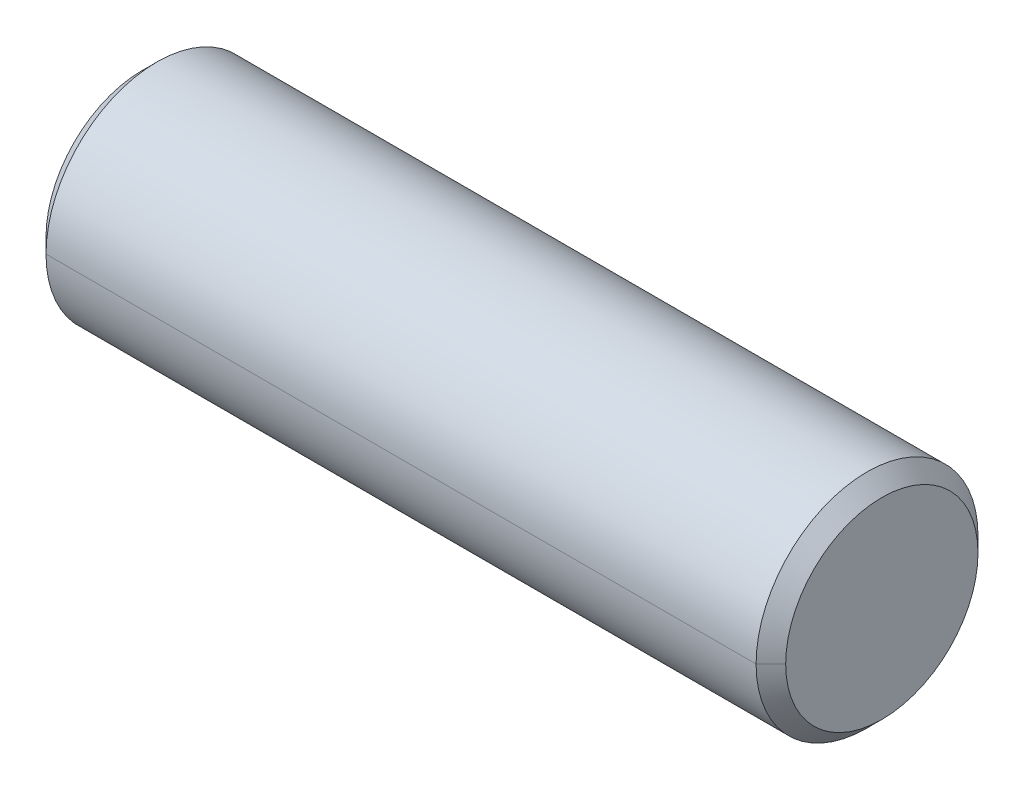
ISO-10303-21;
HEADER;
FILE_DESCRIPTION(('STEP AP214'),'2;1');
FILE_NAME('part.step','',(''),(''),'','','');
FILE_SCHEMA(('AUTOMOTIVE_DESIGN { 1 0 10303 214 1 1 1 1 }'));
ENDSEC;
DATA;
#1=APPLICATION_CONTEXT('core data for automotive mechanical design processes');
#2=APPLICATION_PROTOCOL_DEFINITION('international standard','automotive_design',2000,#1);
#3=PRODUCT_CONTEXT('',#1,'mechanical');
#4=PRODUCT('Part','Part','',(#3));
#5=PRODUCT_RELATED_PRODUCT_CATEGORY('part','',(#4));
#6=PRODUCT_DEFINITION_FORMATION('','',#4);
#7=PRODUCT_DEFINITION_CONTEXT('part definition',#1,'design');
#8=PRODUCT_DEFINITION('design','',#6,#7);
#9=PRODUCT_DEFINITION_SHAPE('','',#8);
#10=(LENGTH_UNIT() NAMED_UNIT(*) SI_UNIT(.MILLI.,.METRE.));
#11=(NAMED_UNIT(*) PLANE_ANGLE_UNIT() SI_UNIT($,.RADIAN.));
#12=(NAMED_UNIT(*) SI_UNIT($,.STERADIAN.) SOLID_ANGLE_UNIT());
#13=UNCERTAINTY_MEASURE_WITH_UNIT(LENGTH_MEASURE(1.E-05),#10,'distance_accuracy_value','');
#14=(GEOMETRIC_REPRESENTATION_CONTEXT(3) GLOBAL_UNCERTAINTY_ASSIGNED_CONTEXT((#13)) GLOBAL_UNIT_ASSIGNED_CONTEXT((#10,
#11,#12)) REPRESENTATION_CONTEXT('',''));
#15=CARTESIAN_POINT('',(0.,0.,0.));
#16=DIRECTION('',(0.,0.,1.));
#17=DIRECTION('',(1.,0.,0.));
#18=AXIS2_PLACEMENT_3D('',#15,#16,#17);
#19=CARTESIAN_POINT('',(5.,0.,0.));
#20=DIRECTION('',(-1.,0.,0.));
#21=DIRECTION('',(0.,0.,1.));
#22=AXIS2_PLACEMENT_3D('',#19,#20,#21);
#23=CONICAL_SURFACE('',#22,1.3,0.785398163397446);
#24=DIRECTION('',(-0.707106781186549,0.,-0.707106781186546));
#25=VECTOR('',#24,1.);
#26=CARTESIAN_POINT('',(5.,0.,-1.3));
#27=LINE('',#26,#25);
#28=CARTESIAN_POINT('',(5.,0.,-1.3));
#29=VERTEX_POINT('',#28);
#30=CARTESIAN_POINT('',(4.8,0.,-1.5));
#31=VERTEX_POINT('',#30);
#32=EDGE_CURVE('E20',#29,#31,#27,.T.);
#33=ORIENTED_EDGE('',*,*,#32,.F.);
#34=CARTESIAN_POINT('',(5.,0.,0.));
#35=DIRECTION('',(1.,0.,0.));
#36=DIRECTION('',(0.,0.,-1.));
#37=AXIS2_PLACEMENT_3D('',#34,#35,#36);
#38=CIRCLE('',#37,1.3);
#39=CARTESIAN_POINT('',(5.,0.,1.3));
#40=VERTEX_POINT('',#39);
#41=EDGE_CURVE('E27',#40,#29,#38,.T.);
#42=ORIENTED_EDGE('',*,*,#41,.F.);
#43=DIRECTION('',(-0.707106781186549,0.,0.707106781186546));
#44=VECTOR('',#43,1.);
#45=CARTESIAN_POINT('',(5.,0.,1.3));
#46=LINE('',#45,#44);
#47=CARTESIAN_POINT('',(4.8,0.,1.5));
#48=VERTEX_POINT('',#47);
#49=EDGE_CURVE('E88',#40,#48,#46,.T.);
#50=ORIENTED_EDGE('',*,*,#49,.T.);
#51=CARTESIAN_POINT('',(4.8,0.,0.));
#52=DIRECTION('',(-1.,0.,0.));
#53=DIRECTION('',(0.,0.,-1.));
#54=AXIS2_PLACEMENT_3D('',#51,#52,#53);
#55=CIRCLE('',#54,1.5);
#56=EDGE_CURVE('E63',#31,#48,#55,.T.);
#57=ORIENTED_EDGE('',*,*,#56,.F.);
#58=EDGE_LOOP('',(#33,#42,#50,#57));
#59=FACE_BOUND('',#58,.T.);
#60=ADVANCED_FACE('F16',(#59),#23,.T.);
#61=CARTESIAN_POINT('',(-4.8,0.,0.));
#62=DIRECTION('',(1.,0.,0.));
#63=DIRECTION('',(0.,0.,-1.));
#64=AXIS2_PLACEMENT_3D('',#61,#62,#63);
#65=CONICAL_SURFACE('',#64,1.5,0.785398163397452);
#66=DIRECTION('',(0.707106781186545,0.,0.70710678118655));
#67=VECTOR('',#66,1.);
#68=CARTESIAN_POINT('',(-4.8,0.,1.5));
#69=LINE('',#68,#67);
#70=CARTESIAN_POINT('',(-5.,0.,1.3));
#71=VERTEX_POINT('',#70);
#72=CARTESIAN_POINT('',(-4.8,0.,1.5));
#73=VERTEX_POINT('',#72);
#74=EDGE_CURVE('E78',#71,#73,#69,.T.);
#75=ORIENTED_EDGE('',*,*,#74,.F.);
#76=CARTESIAN_POINT('',(-5.,0.,0.));
#77=DIRECTION('',(-1.,0.,0.));
#78=DIRECTION('',(0.,0.,-1.));
#79=AXIS2_PLACEMENT_3D('',#76,#77,#78);
#80=CIRCLE('',#79,1.3);
#81=CARTESIAN_POINT('',(-5.,0.,-1.3));
#82=VERTEX_POINT('',#81);
#83=EDGE_CURVE('E11',#82,#71,#80,.T.);
#84=ORIENTED_EDGE('',*,*,#83,.F.);
#85=DIRECTION('',(0.707106781186545,0.,-0.70710678118655));
#86=VECTOR('',#85,1.);
#87=CARTESIAN_POINT('',(-4.8,0.,-1.5));
#88=LINE('',#87,#86);
#89=CARTESIAN_POINT('',(-4.8,0.,-1.5));
#90=VERTEX_POINT('',#89);
#91=EDGE_CURVE('E86',#82,#90,#88,.T.);
#92=ORIENTED_EDGE('',*,*,#91,.T.);
#93=CARTESIAN_POINT('',(-4.8,0.,0.));
#94=DIRECTION('',(1.,0.,0.));
#95=DIRECTION('',(0.,0.,-1.));
#96=AXIS2_PLACEMENT_3D('',#93,#94,#95);
#97=CIRCLE('',#96,1.5);
#98=EDGE_CURVE('E41',#73,#90,#97,.T.);
#99=ORIENTED_EDGE('',*,*,#98,.F.);
#100=EDGE_LOOP('',(#75,#84,#92,#99));
#101=FACE_BOUND('',#100,.T.);
#102=ADVANCED_FACE('F79',(#101),#65,.T.);
#103=CARTESIAN_POINT('',(-5.,0.,0.));
#104=DIRECTION('',(1.,0.,0.));
#105=DIRECTION('',(0.,1.,0.));
#106=AXIS2_PLACEMENT_3D('',#103,#104,#105);
#107=PLANE('',#106);
#108=ORIENTED_EDGE('',*,*,#83,.T.);
#109=CARTESIAN_POINT('',(-5.,0.,0.));
#110=DIRECTION('',(-1.,0.,0.));
#111=DIRECTION('',(0.,0.,-1.));
#112=AXIS2_PLACEMENT_3D('',#109,#110,#111);
#113=CIRCLE('',#112,1.3);
#114=EDGE_CURVE('E73',#71,#82,#113,.T.);
#115=ORIENTED_EDGE('',*,*,#114,.T.);
#116=EDGE_LOOP('',(#108,#115));
#117=FACE_BOUND('',#116,.T.);
#118=ADVANCED_FACE('F71',(#117),#107,.F.);
#119=CARTESIAN_POINT('',(5.,0.,0.));
#120=DIRECTION('',(1.,0.,0.));
#121=DIRECTION('',(0.,1.,0.));
#122=AXIS2_PLACEMENT_3D('',#119,#120,#121);
#123=PLANE('',#122);
#124=ORIENTED_EDGE('',*,*,#41,.T.);
#125=CARTESIAN_POINT('',(5.,0.,0.));
#126=DIRECTION('',(1.,0.,0.));
#127=DIRECTION('',(0.,0.,-1.));
#128=AXIS2_PLACEMENT_3D('',#125,#126,#127);
#129=CIRCLE('',#128,1.3);
#130=EDGE_CURVE('E108',#29,#40,#129,.T.);
#131=ORIENTED_EDGE('',*,*,#130,.T.);
#132=EDGE_LOOP('',(#124,#131));
#133=FACE_BOUND('',#132,.T.);
#134=ADVANCED_FACE('F18',(#133),#123,.T.);
#135=CARTESIAN_POINT('',(5.,0.,0.));
#136=DIRECTION('',(-1.,0.,0.));
#137=DIRECTION('',(0.,0.,1.));
#138=AXIS2_PLACEMENT_3D('',#135,#136,#137);
#139=CYLINDRICAL_SURFACE('',#138,1.5);
#140=DIRECTION('',(-1.,0.,0.));
#141=VECTOR('',#140,1.);
#142=CARTESIAN_POINT('',(5.,0.,-1.5));
#143=LINE('',#142,#141);
#144=EDGE_CURVE('E101',#31,#90,#143,.T.);
#145=ORIENTED_EDGE('',*,*,#144,.F.);
#146=ORIENTED_EDGE('',*,*,#56,.T.);
#147=DIRECTION('',(-1.,0.,0.));
#148=VECTOR('',#147,1.);
#149=CARTESIAN_POINT('',(5.,0.,1.5));
#150=LINE('',#149,#148);
#151=EDGE_CURVE('E107',#48,#73,#150,.T.);
#152=ORIENTED_EDGE('',*,*,#151,.T.);
#153=ORIENTED_EDGE('',*,*,#98,.T.);
#154=EDGE_LOOP('',(#145,#146,#152,#153));
#155=FACE_BOUND('',#154,.T.);
#156=ADVANCED_FACE('F135',(#155),#139,.T.);
#157=CARTESIAN_POINT('',(5.,0.,0.));
#158=DIRECTION('',(-1.,0.,0.));
#159=DIRECTION('',(0.,0.,1.));
#160=AXIS2_PLACEMENT_3D('',#157,#158,#159);
#161=CYLINDRICAL_SURFACE('',#160,1.5);
#162=CARTESIAN_POINT('',(4.8,0.,0.));
#163=DIRECTION('',(-1.,0.,0.));
#164=DIRECTION('',(0.,0.,-1.));
#165=AXIS2_PLACEMENT_3D('',#162,#163,#164);
#166=CIRCLE('',#165,1.5);
#167=EDGE_CURVE('E96',#48,#31,#166,.T.);
#168=ORIENTED_EDGE('',*,*,#167,.T.);
#169=ORIENTED_EDGE('',*,*,#144,.T.);
#170=CARTESIAN_POINT('',(-4.8,0.,0.));
#171=DIRECTION('',(1.,0.,0.));
#172=DIRECTION('',(0.,0.,-1.));
#173=AXIS2_PLACEMENT_3D('',#170,#171,#172);
#174=CIRCLE('',#173,1.5);
#175=EDGE_CURVE('E83',#90,#73,#174,.T.);
#176=ORIENTED_EDGE('',*,*,#175,.T.);
#177=ORIENTED_EDGE('',*,*,#151,.F.);
#178=EDGE_LOOP('',(#168,#169,#176,#177));
#179=FACE_BOUND('',#178,.T.);
#180=ADVANCED_FACE('F141',(#179),#161,.T.);
#181=CARTESIAN_POINT('',(-4.8,0.,0.));
#182=DIRECTION('',(1.,0.,0.));
#183=DIRECTION('',(0.,0.,-1.));
#184=AXIS2_PLACEMENT_3D('',#181,#182,#183);
#185=CONICAL_SURFACE('',#184,1.5,0.785398163397452);
#186=ORIENTED_EDGE('',*,*,#114,.F.);
#187=ORIENTED_EDGE('',*,*,#74,.T.);
#188=ORIENTED_EDGE('',*,*,#175,.F.);
#189=ORIENTED_EDGE('',*,*,#91,.F.);
#190=EDGE_LOOP('',(#186,#187,#188,#189));
#191=FACE_BOUND('',#190,.T.);
#192=ADVANCED_FACE('F85',(#191),#185,.T.);
#193=CARTESIAN_POINT('',(5.,0.,0.));
#194=DIRECTION('',(-1.,0.,0.));
#195=DIRECTION('',(0.,0.,1.));
#196=AXIS2_PLACEMENT_3D('',#193,#194,#195);
#197=CONICAL_SURFACE('',#196,1.3,0.785398163397446);
#198=ORIENTED_EDGE('',*,*,#130,.F.);
#199=ORIENTED_EDGE('',*,*,#32,.T.);
#200=ORIENTED_EDGE('',*,*,#167,.F.);
#201=ORIENTED_EDGE('',*,*,#49,.F.);
#202=EDGE_LOOP('',(#198,#199,#200,#201));
#203=FACE_BOUND('',#202,.T.);
#204=ADVANCED_FACE('F126',(#203),#197,.T.);
#205=CLOSED_SHELL('',(#60,#102,#118,#134,#156,#180,#192,#204));
#206=MANIFOLD_SOLID_BREP('B1',#205);
#207=ADVANCED_BREP_SHAPE_REPRESENTATION('',(#18,#206),#14);
#208=SHAPE_DEFINITION_REPRESENTATION(#9,#207);
ENDSEC;
END-ISO-10303-21;
